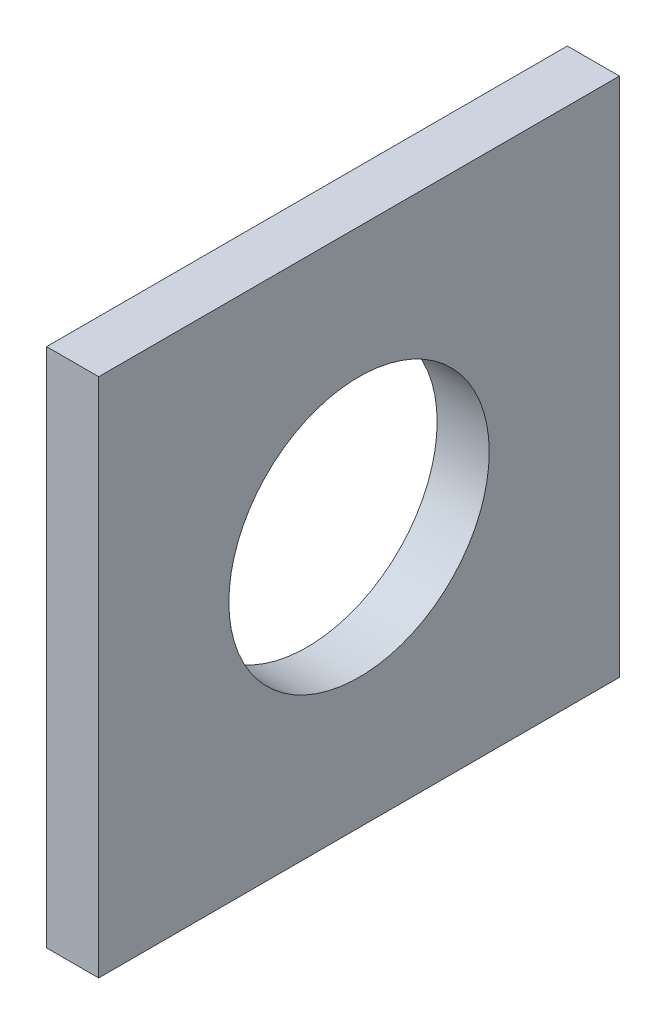
ISO-10303-21;
HEADER;
FILE_DESCRIPTION(('STEP AP214'),'2;1');
FILE_NAME('part.step','',(''),(''),'','','');
FILE_SCHEMA(('AUTOMOTIVE_DESIGN { 1 0 10303 214 1 1 1 1 }'));
ENDSEC;
DATA;
#1=APPLICATION_CONTEXT('core data for automotive mechanical design processes');
#2=APPLICATION_PROTOCOL_DEFINITION('international standard','automotive_design',2000,#1);
#3=PRODUCT_CONTEXT('',#1,'mechanical');
#4=PRODUCT('Part','Part','',(#3));
#5=PRODUCT_RELATED_PRODUCT_CATEGORY('part','',(#4));
#6=PRODUCT_DEFINITION_FORMATION('','',#4);
#7=PRODUCT_DEFINITION_CONTEXT('part definition',#1,'design');
#8=PRODUCT_DEFINITION('design','',#6,#7);
#9=PRODUCT_DEFINITION_SHAPE('','',#8);
#10=(LENGTH_UNIT() NAMED_UNIT(*) SI_UNIT(.MILLI.,.METRE.));
#11=(NAMED_UNIT(*) PLANE_ANGLE_UNIT() SI_UNIT($,.RADIAN.));
#12=(NAMED_UNIT(*) SI_UNIT($,.STERADIAN.) SOLID_ANGLE_UNIT());
#13=UNCERTAINTY_MEASURE_WITH_UNIT(LENGTH_MEASURE(1.E-05),#10,'distance_accuracy_value','');
#14=(GEOMETRIC_REPRESENTATION_CONTEXT(3) GLOBAL_UNCERTAINTY_ASSIGNED_CONTEXT((#13)) GLOBAL_UNIT_ASSIGNED_CONTEXT((#10,
#11,#12)) REPRESENTATION_CONTEXT('',''));
#15=CARTESIAN_POINT('',(0.,0.,0.));
#16=DIRECTION('',(0.,0.,1.));
#17=DIRECTION('',(1.,0.,0.));
#18=AXIS2_PLACEMENT_3D('',#15,#16,#17);
#19=CARTESIAN_POINT('',(2.,0.,0.));
#20=DIRECTION('',(0.,0.,-1.));
#21=DIRECTION('',(0.,1.,0.));
#22=AXIS2_PLACEMENT_3D('',#19,#20,#21);
#23=PLANE('',#22);
#24=DIRECTION('',(0.,-1.,0.));
#25=VECTOR('',#24,1.);
#26=CARTESIAN_POINT('',(0.,0.,0.));
#27=LINE('',#26,#25);
#28=CARTESIAN_POINT('',(0.,20.,0.));
#29=VERTEX_POINT('',#28);
#30=CARTESIAN_POINT('',(0.,0.,0.));
#31=VERTEX_POINT('',#30);
#32=EDGE_CURVE('E96',#29,#31,#27,.T.);
#33=ORIENTED_EDGE('',*,*,#32,.T.);
#34=DIRECTION('',(-1.,0.,0.));
#35=VECTOR('',#34,1.);
#36=CARTESIAN_POINT('',(2.,0.,0.));
#37=LINE('',#36,#35);
#38=CARTESIAN_POINT('',(2.,0.,0.));
#39=VERTEX_POINT('',#38);
#40=EDGE_CURVE('E11',#39,#31,#37,.T.);
#41=ORIENTED_EDGE('',*,*,#40,.F.);
#42=DIRECTION('',(0.,-1.,0.));
#43=VECTOR('',#42,1.);
#44=CARTESIAN_POINT('',(2.,0.,0.));
#45=LINE('',#44,#43);
#46=CARTESIAN_POINT('',(2.,20.,0.));
#47=VERTEX_POINT('',#46);
#48=EDGE_CURVE('E84',#47,#39,#45,.T.);
#49=ORIENTED_EDGE('',*,*,#48,.F.);
#50=DIRECTION('',(-1.,0.,0.));
#51=VECTOR('',#50,1.);
#52=CARTESIAN_POINT('',(2.,20.,0.));
#53=LINE('',#52,#51);
#54=EDGE_CURVE('E92',#47,#29,#53,.T.);
#55=ORIENTED_EDGE('',*,*,#54,.T.);
#56=EDGE_LOOP('',(#33,#41,#49,#55));
#57=FACE_BOUND('',#56,.T.);
#58=ADVANCED_FACE('F33',(#57),#23,.F.);
#59=CARTESIAN_POINT('',(2.,0.,0.));
#60=DIRECTION('',(0.,1.,0.));
#61=DIRECTION('',(0.,0.,1.));
#62=AXIS2_PLACEMENT_3D('',#59,#60,#61);
#63=PLANE('',#62);
#64=DIRECTION('',(0.,0.,-1.));
#65=VECTOR('',#64,1.);
#66=CARTESIAN_POINT('',(0.,0.,0.));
#67=LINE('',#66,#65);
#68=CARTESIAN_POINT('',(0.,0.,-20.));
#69=VERTEX_POINT('',#68);
#70=EDGE_CURVE('E88',#31,#69,#67,.T.);
#71=ORIENTED_EDGE('',*,*,#70,.T.);
#72=DIRECTION('',(-1.,0.,0.));
#73=VECTOR('',#72,1.);
#74=CARTESIAN_POINT('',(2.,0.,-20.));
#75=LINE('',#74,#73);
#76=CARTESIAN_POINT('',(2.,0.,-20.));
#77=VERTEX_POINT('',#76);
#78=EDGE_CURVE('E41',#77,#69,#75,.T.);
#79=ORIENTED_EDGE('',*,*,#78,.F.);
#80=DIRECTION('',(0.,0.,-1.));
#81=VECTOR('',#80,1.);
#82=CARTESIAN_POINT('',(2.,0.,0.));
#83=LINE('',#82,#81);
#84=EDGE_CURVE('E79',#39,#77,#83,.T.);
#85=ORIENTED_EDGE('',*,*,#84,.F.);
#86=ORIENTED_EDGE('',*,*,#40,.T.);
#87=EDGE_LOOP('',(#71,#79,#85,#86));
#88=FACE_BOUND('',#87,.T.);
#89=ADVANCED_FACE('F87',(#88),#63,.F.);
#90=CARTESIAN_POINT('',(2.,0.,-20.));
#91=DIRECTION('',(0.,0.,1.));
#92=DIRECTION('',(0.,-1.,0.));
#93=AXIS2_PLACEMENT_3D('',#90,#91,#92);
#94=PLANE('',#93);
#95=DIRECTION('',(0.,1.,0.));
#96=VECTOR('',#95,1.);
#97=CARTESIAN_POINT('',(0.,0.,-20.));
#98=LINE('',#97,#96);
#99=CARTESIAN_POINT('',(0.,20.,-20.));
#100=VERTEX_POINT('',#99);
#101=EDGE_CURVE('E66',#69,#100,#98,.T.);
#102=ORIENTED_EDGE('',*,*,#101,.T.);
#103=DIRECTION('',(-1.,0.,0.));
#104=VECTOR('',#103,1.);
#105=CARTESIAN_POINT('',(2.,20.,-20.));
#106=LINE('',#105,#104);
#107=CARTESIAN_POINT('',(2.,20.,-20.));
#108=VERTEX_POINT('',#107);
#109=EDGE_CURVE('E89',#108,#100,#106,.T.);
#110=ORIENTED_EDGE('',*,*,#109,.F.);
#111=DIRECTION('',(0.,1.,0.));
#112=VECTOR('',#111,1.);
#113=CARTESIAN_POINT('',(2.,0.,-20.));
#114=LINE('',#113,#112);
#115=EDGE_CURVE('E82',#77,#108,#114,.T.);
#116=ORIENTED_EDGE('',*,*,#115,.F.);
#117=ORIENTED_EDGE('',*,*,#78,.T.);
#118=EDGE_LOOP('',(#102,#110,#116,#117));
#119=FACE_BOUND('',#118,.T.);
#120=ADVANCED_FACE('F90',(#119),#94,.F.);
#121=CARTESIAN_POINT('',(2.,20.,0.));
#122=DIRECTION('',(0.,-1.,0.));
#123=DIRECTION('',(0.,0.,-1.));
#124=AXIS2_PLACEMENT_3D('',#121,#122,#123);
#125=PLANE('',#124);
#126=DIRECTION('',(0.,0.,1.));
#127=VECTOR('',#126,1.);
#128=CARTESIAN_POINT('',(0.,20.,0.));
#129=LINE('',#128,#127);
#130=EDGE_CURVE('E72',#100,#29,#129,.T.);
#131=ORIENTED_EDGE('',*,*,#130,.T.);
#132=ORIENTED_EDGE('',*,*,#54,.F.);
#133=DIRECTION('',(0.,0.,1.));
#134=VECTOR('',#133,1.);
#135=CARTESIAN_POINT('',(2.,20.,0.));
#136=LINE('',#135,#134);
#137=EDGE_CURVE('E49',#108,#47,#136,.T.);
#138=ORIENTED_EDGE('',*,*,#137,.F.);
#139=ORIENTED_EDGE('',*,*,#109,.T.);
#140=EDGE_LOOP('',(#131,#132,#138,#139));
#141=FACE_BOUND('',#140,.T.);
#142=ADVANCED_FACE('F104',(#141),#125,.F.);
#143=CARTESIAN_POINT('',(2.,0.,0.));
#144=DIRECTION('',(-1.,0.,0.));
#145=DIRECTION('',(0.,0.,1.));
#146=AXIS2_PLACEMENT_3D('',#143,#144,#145);
#147=PLANE('',#146);
#148=CARTESIAN_POINT('',(2.,10.,-10.));
#149=DIRECTION('',(1.,0.,0.));
#150=DIRECTION('',(0.,0.,-1.));
#151=AXIS2_PLACEMENT_3D('',#148,#149,#150);
#152=CIRCLE('',#151,5.);
#153=CARTESIAN_POINT('',(2.,10.,-15.));
#154=VERTEX_POINT('',#153);
#155=EDGE_CURVE('E110',#154,#154,#152,.T.);
#156=ORIENTED_EDGE('',*,*,#155,.F.);
#157=EDGE_LOOP('',(#156));
#158=FACE_BOUND('',#157,.T.);
#159=ORIENTED_EDGE('',*,*,#48,.T.);
#160=ORIENTED_EDGE('',*,*,#84,.T.);
#161=ORIENTED_EDGE('',*,*,#115,.T.);
#162=ORIENTED_EDGE('',*,*,#137,.T.);
#163=EDGE_LOOP('',(#159,#160,#161,#162));
#164=FACE_BOUND('',#163,.T.);
#165=ADVANCED_FACE('F80',(#158,#164),#147,.F.);
#166=CARTESIAN_POINT('',(0.,0.,0.));
#167=DIRECTION('',(-1.,0.,0.));
#168=DIRECTION('',(0.,0.,1.));
#169=AXIS2_PLACEMENT_3D('',#166,#167,#168);
#170=PLANE('',#169);
#171=CARTESIAN_POINT('',(0.,10.,-10.));
#172=DIRECTION('',(1.,0.,0.));
#173=DIRECTION('',(0.,0.,-1.));
#174=AXIS2_PLACEMENT_3D('',#171,#172,#173);
#175=CIRCLE('',#174,5.);
#176=CARTESIAN_POINT('',(0.,10.,-15.));
#177=VERTEX_POINT('',#176);
#178=EDGE_CURVE('E99',#177,#177,#175,.T.);
#179=ORIENTED_EDGE('',*,*,#178,.T.);
#180=EDGE_LOOP('',(#179));
#181=FACE_BOUND('',#180,.T.);
#182=ORIENTED_EDGE('',*,*,#32,.F.);
#183=ORIENTED_EDGE('',*,*,#130,.F.);
#184=ORIENTED_EDGE('',*,*,#101,.F.);
#185=ORIENTED_EDGE('',*,*,#70,.F.);
#186=EDGE_LOOP('',(#182,#183,#184,#185));
#187=FACE_BOUND('',#186,.T.);
#188=ADVANCED_FACE('F107',(#181,#187),#170,.T.);
#189=CARTESIAN_POINT('',(0.,10.,-10.));
#190=DIRECTION('',(1.,0.,0.));
#191=DIRECTION('',(0.,0.,-1.));
#192=AXIS2_PLACEMENT_3D('',#189,#190,#191);
#193=CYLINDRICAL_SURFACE('',#192,5.);
#194=ORIENTED_EDGE('',*,*,#178,.F.);
#195=EDGE_LOOP('',(#194));
#196=FACE_BOUND('',#195,.T.);
#197=ORIENTED_EDGE('',*,*,#155,.T.);
#198=EDGE_LOOP('',(#197));
#199=FACE_BOUND('',#198,.T.);
#200=ADVANCED_FACE('F117',(#196,#199),#193,.F.);
#201=CLOSED_SHELL('',(#58,#89,#120,#142,#165,#188,#200));
#202=MANIFOLD_SOLID_BREP('B2',#201);
#203=ADVANCED_BREP_SHAPE_REPRESENTATION('',(#18,#202),#14);
#204=SHAPE_DEFINITION_REPRESENTATION(#9,#203);
ENDSEC;
END-ISO-10303-21;
